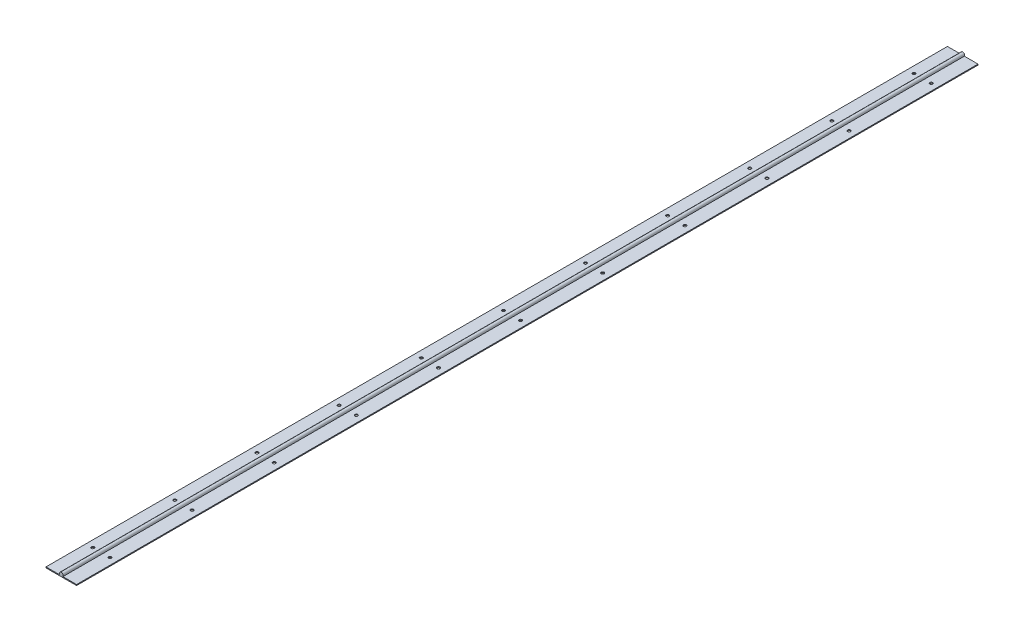
ISO-10303-21;
HEADER;
FILE_DESCRIPTION(('STEP AP214'),'2;1');
FILE_NAME('part.step','',(''),(''),'','','');
FILE_SCHEMA(('AUTOMOTIVE_DESIGN { 1 0 10303 214 1 1 1 1 }'));
ENDSEC;
DATA;
#1=APPLICATION_CONTEXT('core data for automotive mechanical design processes');
#2=APPLICATION_PROTOCOL_DEFINITION('international standard','automotive_design',2000,#1);
#3=PRODUCT_CONTEXT('',#1,'mechanical');
#4=PRODUCT('Part','Part','',(#3));
#5=PRODUCT_RELATED_PRODUCT_CATEGORY('part','',(#4));
#6=PRODUCT_DEFINITION_FORMATION('','',#4);
#7=PRODUCT_DEFINITION_CONTEXT('part definition',#1,'design');
#8=PRODUCT_DEFINITION('design','',#6,#7);
#9=PRODUCT_DEFINITION_SHAPE('','',#8);
#10=(LENGTH_UNIT() NAMED_UNIT(*) SI_UNIT(.MILLI.,.METRE.));
#11=(NAMED_UNIT(*) PLANE_ANGLE_UNIT() SI_UNIT($,.RADIAN.));
#12=(NAMED_UNIT(*) SI_UNIT($,.STERADIAN.) SOLID_ANGLE_UNIT());
#13=UNCERTAINTY_MEASURE_WITH_UNIT(LENGTH_MEASURE(1.E-05),#10,'distance_accuracy_value','');
#14=(GEOMETRIC_REPRESENTATION_CONTEXT(3) GLOBAL_UNCERTAINTY_ASSIGNED_CONTEXT((#13)) GLOBAL_UNIT_ASSIGNED_CONTEXT((#10,
#11,#12)) REPRESENTATION_CONTEXT('',''));
#15=CARTESIAN_POINT('',(0.,0.,0.));
#16=DIRECTION('',(0.,0.,1.));
#17=DIRECTION('',(1.,0.,0.));
#18=AXIS2_PLACEMENT_3D('',#15,#16,#17);
#19=CARTESIAN_POINT('',(-25.4000000000001,0.,-1498.6));
#20=DIRECTION('',(0.,-1.,0.));
#21=DIRECTION('',(0.,0.,-1.));
#22=AXIS2_PLACEMENT_3D('',#19,#20,#21);
#23=PLANE('',#22);
#24=CARTESIAN_POINT('',(-14.3002000000001,0.,-1431.925));
#25=DIRECTION('',(0.,1.,0.));
#26=DIRECTION('',(0.,0.,1.));
#27=AXIS2_PLACEMENT_3D('',#24,#25,#26);
#28=CIRCLE('',#27,2.4257);
#29=CARTESIAN_POINT('',(-14.3002000000001,0.,-1429.4993));
#30=VERTEX_POINT('',#29);
#31=EDGE_CURVE('E196',#30,#30,#28,.T.);
#32=ORIENTED_EDGE('',*,*,#31,.T.);
#33=EDGE_LOOP('',(#32));
#34=FACE_BOUND('',#33,.T.);
#35=CARTESIAN_POINT('',(-14.3002000000002,0.,-1295.4));
#36=DIRECTION('',(0.,1.,0.));
#37=DIRECTION('',(0.,0.,1.));
#38=AXIS2_PLACEMENT_3D('',#35,#36,#37);
#39=CIRCLE('',#38,2.4257);
#40=CARTESIAN_POINT('',(-14.3002000000002,0.,-1292.9743));
#41=VERTEX_POINT('',#40);
#42=EDGE_CURVE('E190',#41,#41,#39,.T.);
#43=ORIENTED_EDGE('',*,*,#42,.T.);
#44=EDGE_LOOP('',(#43));
#45=FACE_BOUND('',#44,.T.);
#46=CARTESIAN_POINT('',(-14.3002000000001,0.,-1158.875));
#47=DIRECTION('',(0.,1.,0.));
#48=DIRECTION('',(0.,0.,1.));
#49=AXIS2_PLACEMENT_3D('',#46,#47,#48);
#50=CIRCLE('',#49,2.4257);
#51=CARTESIAN_POINT('',(-14.3002000000001,0.,-1156.4493));
#52=VERTEX_POINT('',#51);
#53=EDGE_CURVE('E184',#52,#52,#50,.T.);
#54=ORIENTED_EDGE('',*,*,#53,.T.);
#55=EDGE_LOOP('',(#54));
#56=FACE_BOUND('',#55,.T.);
#57=CARTESIAN_POINT('',(-14.3002000000001,0.,-1022.35));
#58=DIRECTION('',(0.,1.,0.));
#59=DIRECTION('',(0.,0.,1.));
#60=AXIS2_PLACEMENT_3D('',#57,#58,#59);
#61=CIRCLE('',#60,2.4257);
#62=CARTESIAN_POINT('',(-14.3002000000001,0.,-1019.9243));
#63=VERTEX_POINT('',#62);
#64=EDGE_CURVE('E178',#63,#63,#61,.T.);
#65=ORIENTED_EDGE('',*,*,#64,.T.);
#66=EDGE_LOOP('',(#65));
#67=FACE_BOUND('',#66,.T.);
#68=CARTESIAN_POINT('',(-14.3002000000001,0.,-885.825));
#69=DIRECTION('',(0.,1.,0.));
#70=DIRECTION('',(0.,0.,1.));
#71=AXIS2_PLACEMENT_3D('',#68,#69,#70);
#72=CIRCLE('',#71,2.4257);
#73=CARTESIAN_POINT('',(-14.3002000000001,0.,-883.3993));
#74=VERTEX_POINT('',#73);
#75=EDGE_CURVE('E172',#74,#74,#72,.T.);
#76=ORIENTED_EDGE('',*,*,#75,.T.);
#77=EDGE_LOOP('',(#76));
#78=FACE_BOUND('',#77,.T.);
#79=CARTESIAN_POINT('',(-14.3002000000001,0.,-749.3));
#80=DIRECTION('',(0.,1.,0.));
#81=DIRECTION('',(0.,0.,1.));
#82=AXIS2_PLACEMENT_3D('',#79,#80,#81);
#83=CIRCLE('',#82,2.4257);
#84=CARTESIAN_POINT('',(-14.3002000000001,0.,-746.8743));
#85=VERTEX_POINT('',#84);
#86=EDGE_CURVE('E166',#85,#85,#83,.T.);
#87=ORIENTED_EDGE('',*,*,#86,.T.);
#88=EDGE_LOOP('',(#87));
#89=FACE_BOUND('',#88,.T.);
#90=CARTESIAN_POINT('',(-14.3002000000001,0.,-612.775));
#91=DIRECTION('',(0.,1.,0.));
#92=DIRECTION('',(0.,0.,1.));
#93=AXIS2_PLACEMENT_3D('',#90,#91,#92);
#94=CIRCLE('',#93,2.4257);
#95=CARTESIAN_POINT('',(-14.3002000000001,0.,-610.3493));
#96=VERTEX_POINT('',#95);
#97=EDGE_CURVE('E160',#96,#96,#94,.T.);
#98=ORIENTED_EDGE('',*,*,#97,.T.);
#99=EDGE_LOOP('',(#98));
#100=FACE_BOUND('',#99,.T.);
#101=CARTESIAN_POINT('',(-14.3002000000001,0.,-476.25));
#102=DIRECTION('',(0.,1.,0.));
#103=DIRECTION('',(0.,0.,1.));
#104=AXIS2_PLACEMENT_3D('',#101,#102,#103);
#105=CIRCLE('',#104,2.4257);
#106=CARTESIAN_POINT('',(-14.3002000000001,0.,-473.8243));
#107=VERTEX_POINT('',#106);
#108=EDGE_CURVE('E154',#107,#107,#105,.T.);
#109=ORIENTED_EDGE('',*,*,#108,.T.);
#110=EDGE_LOOP('',(#109));
#111=FACE_BOUND('',#110,.T.);
#112=CARTESIAN_POINT('',(-14.3002000000001,0.,-339.725));
#113=DIRECTION('',(0.,1.,0.));
#114=DIRECTION('',(0.,0.,1.));
#115=AXIS2_PLACEMENT_3D('',#112,#113,#114);
#116=CIRCLE('',#115,2.4257);
#117=CARTESIAN_POINT('',(-14.3002000000001,0.,-337.2993));
#118=VERTEX_POINT('',#117);
#119=EDGE_CURVE('E148',#118,#118,#116,.T.);
#120=ORIENTED_EDGE('',*,*,#119,.T.);
#121=EDGE_LOOP('',(#120));
#122=FACE_BOUND('',#121,.T.);
#123=CARTESIAN_POINT('',(-14.3002,0.,-203.2));
#124=DIRECTION('',(0.,1.,0.));
#125=DIRECTION('',(0.,0.,1.));
#126=AXIS2_PLACEMENT_3D('',#123,#124,#125);
#127=CIRCLE('',#126,2.4257);
#128=CARTESIAN_POINT('',(-14.3002,0.,-200.7743));
#129=VERTEX_POINT('',#128);
#130=EDGE_CURVE('E602',#129,#129,#127,.T.);
#131=ORIENTED_EDGE('',*,*,#130,.T.);
#132=EDGE_LOOP('',(#131));
#133=FACE_BOUND('',#132,.T.);
#134=CARTESIAN_POINT('',(14.3002,0.,-66.675));
#135=DIRECTION('',(0.,1.,0.));
#136=DIRECTION('',(0.,0.,1.));
#137=AXIS2_PLACEMENT_3D('',#134,#135,#136);
#138=CIRCLE('',#137,2.4257);
#139=CARTESIAN_POINT('',(14.3002,0.,-64.2493));
#140=VERTEX_POINT('',#139);
#141=EDGE_CURVE('E111',#140,#140,#138,.T.);
#142=ORIENTED_EDGE('',*,*,#141,.T.);
#143=EDGE_LOOP('',(#142));
#144=FACE_BOUND('',#143,.T.);
#145=DIRECTION('',(1.,0.,0.));
#146=VECTOR('',#145,1.);
#147=CARTESIAN_POINT('',(-25.4,0.,1.11022302462516E-13));
#148=LINE('',#147,#146);
#149=CARTESIAN_POINT('',(-25.4,0.,1.11022302462516E-13));
#150=VERTEX_POINT('',#149);
#151=CARTESIAN_POINT('',(25.4,0.,0.));
#152=VERTEX_POINT('',#151);
#153=EDGE_CURVE('E98',#150,#152,#148,.T.);
#154=ORIENTED_EDGE('',*,*,#153,.F.);
#155=DIRECTION('',(0.,0.,1.));
#156=VECTOR('',#155,1.);
#157=CARTESIAN_POINT('',(-25.4000000000001,0.,-1498.6));
#158=LINE('',#157,#156);
#159=CARTESIAN_POINT('',(-25.4000000000001,0.,-1498.6));
#160=VERTEX_POINT('',#159);
#161=EDGE_CURVE('E84',#160,#150,#158,.T.);
#162=ORIENTED_EDGE('',*,*,#161,.F.);
#163=DIRECTION('',(1.,0.,0.));
#164=VECTOR('',#163,1.);
#165=CARTESIAN_POINT('',(-25.4000000000001,0.,-1498.6));
#166=LINE('',#165,#164);
#167=CARTESIAN_POINT('',(25.3999999999999,0.,-1498.6));
#168=VERTEX_POINT('',#167);
#169=EDGE_CURVE('E123',#160,#168,#166,.T.);
#170=ORIENTED_EDGE('',*,*,#169,.T.);
#171=DIRECTION('',(0.,0.,1.));
#172=VECTOR('',#171,1.);
#173=CARTESIAN_POINT('',(25.3999999999999,0.,-1498.6));
#174=LINE('',#173,#172);
#175=EDGE_CURVE('E94',#168,#152,#174,.T.);
#176=ORIENTED_EDGE('',*,*,#175,.T.);
#177=EDGE_LOOP('',(#154,#162,#170,#176));
#178=FACE_BOUND('',#177,.T.);
#179=CARTESIAN_POINT('',(-14.3002000000001,0.,-66.675));
#180=DIRECTION('',(0.,1.,0.));
#181=DIRECTION('',(0.,0.,1.));
#182=AXIS2_PLACEMENT_3D('',#179,#180,#181);
#183=CIRCLE('',#182,2.4257);
#184=CARTESIAN_POINT('',(-14.3002000000001,0.,-64.2493));
#185=VERTEX_POINT('',#184);
#186=EDGE_CURVE('E145',#185,#185,#183,.T.);
#187=ORIENTED_EDGE('',*,*,#186,.T.);
#188=EDGE_LOOP('',(#187));
#189=FACE_BOUND('',#188,.T.);
#190=CARTESIAN_POINT('',(14.3002,0.,-203.2));
#191=DIRECTION('',(0.,1.,0.));
#192=DIRECTION('',(0.,0.,1.));
#193=AXIS2_PLACEMENT_3D('',#190,#191,#192);
#194=CIRCLE('',#193,2.4257);
#195=CARTESIAN_POINT('',(14.3002,0.,-200.7743));
#196=VERTEX_POINT('',#195);
#197=EDGE_CURVE('E611',#196,#196,#194,.T.);
#198=ORIENTED_EDGE('',*,*,#197,.T.);
#199=EDGE_LOOP('',(#198));
#200=FACE_BOUND('',#199,.T.);
#201=CARTESIAN_POINT('',(14.3001999999999,0.,-339.725));
#202=DIRECTION('',(0.,1.,0.));
#203=DIRECTION('',(0.,0.,1.));
#204=AXIS2_PLACEMENT_3D('',#201,#202,#203);
#205=CIRCLE('',#204,2.4257);
#206=CARTESIAN_POINT('',(14.3001999999999,0.,-337.2993));
#207=VERTEX_POINT('',#206);
#208=EDGE_CURVE('E202',#207,#207,#205,.T.);
#209=ORIENTED_EDGE('',*,*,#208,.T.);
#210=EDGE_LOOP('',(#209));
#211=FACE_BOUND('',#210,.T.);
#212=CARTESIAN_POINT('',(14.3002,0.,-476.25));
#213=DIRECTION('',(0.,1.,0.));
#214=DIRECTION('',(0.,0.,1.));
#215=AXIS2_PLACEMENT_3D('',#212,#213,#214);
#216=CIRCLE('',#215,2.4257);
#217=CARTESIAN_POINT('',(14.3002,0.,-473.8243));
#218=VERTEX_POINT('',#217);
#219=EDGE_CURVE('E208',#218,#218,#216,.T.);
#220=ORIENTED_EDGE('',*,*,#219,.T.);
#221=EDGE_LOOP('',(#220));
#222=FACE_BOUND('',#221,.T.);
#223=CARTESIAN_POINT('',(14.3001999999999,0.,-612.775));
#224=DIRECTION('',(0.,1.,0.));
#225=DIRECTION('',(0.,0.,1.));
#226=AXIS2_PLACEMENT_3D('',#223,#224,#225);
#227=CIRCLE('',#226,2.4257);
#228=CARTESIAN_POINT('',(14.3001999999999,0.,-610.3493));
#229=VERTEX_POINT('',#228);
#230=EDGE_CURVE('E214',#229,#229,#227,.T.);
#231=ORIENTED_EDGE('',*,*,#230,.T.);
#232=EDGE_LOOP('',(#231));
#233=FACE_BOUND('',#232,.T.);
#234=CARTESIAN_POINT('',(14.3001999999999,0.,-749.3));
#235=DIRECTION('',(0.,1.,0.));
#236=DIRECTION('',(0.,0.,1.));
#237=AXIS2_PLACEMENT_3D('',#234,#235,#236);
#238=CIRCLE('',#237,2.4257);
#239=CARTESIAN_POINT('',(14.3001999999999,0.,-746.8743));
#240=VERTEX_POINT('',#239);
#241=EDGE_CURVE('E220',#240,#240,#238,.T.);
#242=ORIENTED_EDGE('',*,*,#241,.T.);
#243=EDGE_LOOP('',(#242));
#244=FACE_BOUND('',#243,.T.);
#245=CARTESIAN_POINT('',(14.3001999999999,0.,-885.825));
#246=DIRECTION('',(0.,1.,0.));
#247=DIRECTION('',(0.,0.,1.));
#248=AXIS2_PLACEMENT_3D('',#245,#246,#247);
#249=CIRCLE('',#248,2.4257);
#250=CARTESIAN_POINT('',(14.3001999999999,0.,-883.3993));
#251=VERTEX_POINT('',#250);
#252=EDGE_CURVE('E226',#251,#251,#249,.T.);
#253=ORIENTED_EDGE('',*,*,#252,.T.);
#254=EDGE_LOOP('',(#253));
#255=FACE_BOUND('',#254,.T.);
#256=CARTESIAN_POINT('',(14.3001999999999,0.,-1022.35));
#257=DIRECTION('',(0.,1.,0.));
#258=DIRECTION('',(0.,0.,1.));
#259=AXIS2_PLACEMENT_3D('',#256,#257,#258);
#260=CIRCLE('',#259,2.4257);
#261=CARTESIAN_POINT('',(14.3001999999999,0.,-1019.9243));
#262=VERTEX_POINT('',#261);
#263=EDGE_CURVE('E232',#262,#262,#260,.T.);
#264=ORIENTED_EDGE('',*,*,#263,.T.);
#265=EDGE_LOOP('',(#264));
#266=FACE_BOUND('',#265,.T.);
#267=CARTESIAN_POINT('',(14.3001999999999,0.,-1158.875));
#268=DIRECTION('',(0.,1.,0.));
#269=DIRECTION('',(0.,0.,1.));
#270=AXIS2_PLACEMENT_3D('',#267,#268,#269);
#271=CIRCLE('',#270,2.4257);
#272=CARTESIAN_POINT('',(14.3001999999999,0.,-1156.4493));
#273=VERTEX_POINT('',#272);
#274=EDGE_CURVE('E238',#273,#273,#271,.T.);
#275=ORIENTED_EDGE('',*,*,#274,.T.);
#276=EDGE_LOOP('',(#275));
#277=FACE_BOUND('',#276,.T.);
#278=CARTESIAN_POINT('',(14.3001999999999,0.,-1295.4));
#279=DIRECTION('',(0.,1.,0.));
#280=DIRECTION('',(0.,0.,1.));
#281=AXIS2_PLACEMENT_3D('',#278,#279,#280);
#282=CIRCLE('',#281,2.4257);
#283=CARTESIAN_POINT('',(14.3001999999999,0.,-1292.9743));
#284=VERTEX_POINT('',#283);
#285=EDGE_CURVE('E244',#284,#284,#282,.T.);
#286=ORIENTED_EDGE('',*,*,#285,.T.);
#287=EDGE_LOOP('',(#286));
#288=FACE_BOUND('',#287,.T.);
#289=CARTESIAN_POINT('',(14.3001999999999,0.,-1431.925));
#290=DIRECTION('',(0.,1.,0.));
#291=DIRECTION('',(0.,0.,1.));
#292=AXIS2_PLACEMENT_3D('',#289,#290,#291);
#293=CIRCLE('',#292,2.4257);
#294=CARTESIAN_POINT('',(14.3001999999999,0.,-1429.4993));
#295=VERTEX_POINT('',#294);
#296=EDGE_CURVE('E11',#295,#295,#293,.T.);
#297=ORIENTED_EDGE('',*,*,#296,.T.);
#298=EDGE_LOOP('',(#297));
#299=FACE_BOUND('',#298,.T.);
#300=ADVANCED_FACE('F32',(#34,#45,#56,#67,#78,#89,#100,#111,#122,#133,#144,#178,#189,#200,#211,
#222,#233,#244,#255,#266,#277,#288,#299),#23,.T.);
#301=CARTESIAN_POINT('',(25.3999999999999,1.52399999999996,-1498.6));
#302=DIRECTION('',(0.,1.,0.));
#303=DIRECTION('',(-1.,0.,0.));
#304=AXIS2_PLACEMENT_3D('',#301,#302,#303);
#305=PLANE('',#304);
#306=CARTESIAN_POINT('',(14.3002,1.52400000000001,-66.675));
#307=DIRECTION('',(0.,1.,0.));
#308=DIRECTION('',(-1.,0.,0.));
#309=AXIS2_PLACEMENT_3D('',#306,#307,#308);
#310=CIRCLE('',#309,2.4257);
#311=CARTESIAN_POINT('',(11.8745,1.52400000000001,-66.675));
#312=VERTEX_POINT('',#311);
#313=EDGE_CURVE('E108',#312,#312,#310,.F.);
#314=ORIENTED_EDGE('',*,*,#313,.T.);
#315=EDGE_LOOP('',(#314));
#316=FACE_BOUND('',#315,.T.);
#317=DIRECTION('',(-1.,0.,0.));
#318=VECTOR('',#317,1.);
#319=CARTESIAN_POINT('',(25.4,1.52400000000003,0.));
#320=LINE('',#319,#318);
#321=CARTESIAN_POINT('',(25.4,1.52400000000003,0.));
#322=VERTEX_POINT('',#321);
#323=CARTESIAN_POINT('',(2.71197787601593,1.52399999999998,-1.11022302462516E-13));
#324=VERTEX_POINT('',#323);
#325=EDGE_CURVE('E116',#322,#324,#320,.T.);
#326=ORIENTED_EDGE('',*,*,#325,.F.);
#327=DIRECTION('',(0.,0.,1.));
#328=VECTOR('',#327,1.);
#329=CARTESIAN_POINT('',(25.3999999999999,1.52399999999996,-1498.6));
#330=LINE('',#329,#328);
#331=CARTESIAN_POINT('',(25.3999999999999,1.52399999999996,-1498.6));
#332=VERTEX_POINT('',#331);
#333=EDGE_CURVE('E139',#332,#322,#330,.T.);
#334=ORIENTED_EDGE('',*,*,#333,.F.);
#335=DIRECTION('',(-1.,0.,0.));
#336=VECTOR('',#335,1.);
#337=CARTESIAN_POINT('',(25.3999999999999,1.52399999999996,-1498.6));
#338=LINE('',#337,#336);
#339=CARTESIAN_POINT('',(2.71197787601588,1.52399999999996,-1498.6));
#340=VERTEX_POINT('',#339);
#341=EDGE_CURVE('E128',#332,#340,#338,.T.);
#342=ORIENTED_EDGE('',*,*,#341,.T.);
#343=DIRECTION('',(0.,0.,1.));
#344=VECTOR('',#343,1.);
#345=CARTESIAN_POINT('',(2.71197787601588,1.52399999999996,-1498.6));
#346=LINE('',#345,#344);
#347=EDGE_CURVE('E137',#340,#324,#346,.T.);
#348=ORIENTED_EDGE('',*,*,#347,.T.);
#349=EDGE_LOOP('',(#326,#334,#342,#348));
#350=FACE_BOUND('',#349,.T.);
#351=CARTESIAN_POINT('',(14.3001999999999,1.524,-203.2));
#352=DIRECTION('',(0.,1.,0.));
#353=DIRECTION('',(-1.,0.,0.));
#354=AXIS2_PLACEMENT_3D('',#351,#352,#353);
#355=CIRCLE('',#354,2.4257);
#356=CARTESIAN_POINT('',(11.8744999999999,1.524,-203.2));
#357=VERTEX_POINT('',#356);
#358=EDGE_CURVE('E614',#357,#357,#355,.F.);
#359=ORIENTED_EDGE('',*,*,#358,.T.);
#360=EDGE_LOOP('',(#359));
#361=FACE_BOUND('',#360,.T.);
#362=CARTESIAN_POINT('',(14.3001999999999,1.524,-339.725));
#363=DIRECTION('',(0.,1.,0.));
#364=DIRECTION('',(-1.,0.,0.));
#365=AXIS2_PLACEMENT_3D('',#362,#363,#364);
#366=CIRCLE('',#365,2.4257);
#367=CARTESIAN_POINT('',(11.8744999999999,1.524,-339.725));
#368=VERTEX_POINT('',#367);
#369=EDGE_CURVE('E199',#368,#368,#366,.F.);
#370=ORIENTED_EDGE('',*,*,#369,.T.);
#371=EDGE_LOOP('',(#370));
#372=FACE_BOUND('',#371,.T.);
#373=CARTESIAN_POINT('',(14.3001999999999,1.52399999999998,-476.25));
#374=DIRECTION('',(0.,1.,0.));
#375=DIRECTION('',(-1.,0.,0.));
#376=AXIS2_PLACEMENT_3D('',#373,#374,#375);
#377=CIRCLE('',#376,2.4257);
#378=CARTESIAN_POINT('',(11.8744999999999,1.52399999999998,-476.25));
#379=VERTEX_POINT('',#378);
#380=EDGE_CURVE('E205',#379,#379,#377,.F.);
#381=ORIENTED_EDGE('',*,*,#380,.T.);
#382=EDGE_LOOP('',(#381));
#383=FACE_BOUND('',#382,.T.);
#384=CARTESIAN_POINT('',(14.3001999999999,1.524,-612.775));
#385=DIRECTION('',(0.,1.,0.));
#386=DIRECTION('',(-1.,0.,0.));
#387=AXIS2_PLACEMENT_3D('',#384,#385,#386);
#388=CIRCLE('',#387,2.4257);
#389=CARTESIAN_POINT('',(11.8744999999999,1.524,-612.775));
#390=VERTEX_POINT('',#389);
#391=EDGE_CURVE('E211',#390,#390,#388,.F.);
#392=ORIENTED_EDGE('',*,*,#391,.T.);
#393=EDGE_LOOP('',(#392));
#394=FACE_BOUND('',#393,.T.);
#395=CARTESIAN_POINT('',(14.3001999999999,1.52399999999998,-749.3));
#396=DIRECTION('',(0.,1.,0.));
#397=DIRECTION('',(-1.,0.,0.));
#398=AXIS2_PLACEMENT_3D('',#395,#396,#397);
#399=CIRCLE('',#398,2.4257);
#400=CARTESIAN_POINT('',(11.8744999999999,1.52399999999998,-749.3));
#401=VERTEX_POINT('',#400);
#402=EDGE_CURVE('E217',#401,#401,#399,.F.);
#403=ORIENTED_EDGE('',*,*,#402,.T.);
#404=EDGE_LOOP('',(#403));
#405=FACE_BOUND('',#404,.T.);
#406=CARTESIAN_POINT('',(14.3001999999999,1.52399999999996,-885.825));
#407=DIRECTION('',(0.,1.,0.));
#408=DIRECTION('',(-1.,0.,0.));
#409=AXIS2_PLACEMENT_3D('',#406,#407,#408);
#410=CIRCLE('',#409,2.4257);
#411=CARTESIAN_POINT('',(11.8744999999999,1.52399999999996,-885.825));
#412=VERTEX_POINT('',#411);
#413=EDGE_CURVE('E223',#412,#412,#410,.F.);
#414=ORIENTED_EDGE('',*,*,#413,.T.);
#415=EDGE_LOOP('',(#414));
#416=FACE_BOUND('',#415,.T.);
#417=CARTESIAN_POINT('',(14.3001999999999,1.52399999999994,-1022.35));
#418=DIRECTION('',(0.,1.,0.));
#419=DIRECTION('',(-1.,0.,0.));
#420=AXIS2_PLACEMENT_3D('',#417,#418,#419);
#421=CIRCLE('',#420,2.4257);
#422=CARTESIAN_POINT('',(11.8744999999999,1.52399999999994,-1022.35));
#423=VERTEX_POINT('',#422);
#424=EDGE_CURVE('E229',#423,#423,#421,.F.);
#425=ORIENTED_EDGE('',*,*,#424,.T.);
#426=EDGE_LOOP('',(#425));
#427=FACE_BOUND('',#426,.T.);
#428=CARTESIAN_POINT('',(14.3001999999999,1.52399999999991,-1158.875));
#429=DIRECTION('',(0.,1.,0.));
#430=DIRECTION('',(-1.,0.,0.));
#431=AXIS2_PLACEMENT_3D('',#428,#429,#430);
#432=CIRCLE('',#431,2.4257);
#433=CARTESIAN_POINT('',(11.8744999999999,1.52399999999991,-1158.875));
#434=VERTEX_POINT('',#433);
#435=EDGE_CURVE('E235',#434,#434,#432,.F.);
#436=ORIENTED_EDGE('',*,*,#435,.T.);
#437=EDGE_LOOP('',(#436));
#438=FACE_BOUND('',#437,.T.);
#439=CARTESIAN_POINT('',(14.3001999999999,1.52399999999993,-1295.4));
#440=DIRECTION('',(0.,1.,0.));
#441=DIRECTION('',(-1.,0.,0.));
#442=AXIS2_PLACEMENT_3D('',#439,#440,#441);
#443=CIRCLE('',#442,2.4257);
#444=CARTESIAN_POINT('',(11.8744999999999,1.52399999999993,-1295.4));
#445=VERTEX_POINT('',#444);
#446=EDGE_CURVE('E241',#445,#445,#443,.F.);
#447=ORIENTED_EDGE('',*,*,#446,.T.);
#448=EDGE_LOOP('',(#447));
#449=FACE_BOUND('',#448,.T.);
#450=CARTESIAN_POINT('',(14.3001999999999,1.52399999999993,-1431.925));
#451=DIRECTION('',(0.,1.,0.));
#452=DIRECTION('',(-1.,0.,0.));
#453=AXIS2_PLACEMENT_3D('',#450,#451,#452);
#454=CIRCLE('',#453,2.4257);
#455=CARTESIAN_POINT('',(11.8744999999999,1.52399999999993,-1431.925));
#456=VERTEX_POINT('',#455);
#457=EDGE_CURVE('E40',#456,#456,#454,.F.);
#458=ORIENTED_EDGE('',*,*,#457,.T.);
#459=EDGE_LOOP('',(#458));
#460=FACE_BOUND('',#459,.T.);
#461=ADVANCED_FACE('F249',(#316,#350,#361,#372,#383,#394,#405,#416,#427,#438,#449,#460),#305,.T.);
#462=CARTESIAN_POINT('',(-2.71197787601601,1.52399999999987,-1498.6));
#463=DIRECTION('',(0.,1.,0.));
#464=DIRECTION('',(-1.,0.,0.));
#465=AXIS2_PLACEMENT_3D('',#462,#463,#464);
#466=PLANE('',#465);
#467=CARTESIAN_POINT('',(-14.3002000000001,1.52400000000001,-66.675));
#468=DIRECTION('',(0.,1.,0.));
#469=DIRECTION('',(-1.,0.,0.));
#470=AXIS2_PLACEMENT_3D('',#467,#468,#469);
#471=CIRCLE('',#470,2.4257);
#472=CARTESIAN_POINT('',(-16.7259000000001,1.52400000000001,-66.675));
#473=VERTEX_POINT('',#472);
#474=EDGE_CURVE('E142',#473,#473,#471,.F.);
#475=ORIENTED_EDGE('',*,*,#474,.T.);
#476=EDGE_LOOP('',(#475));
#477=FACE_BOUND('',#476,.T.);
#478=DIRECTION('',(-1.,0.,0.));
#479=VECTOR('',#478,1.);
#480=CARTESIAN_POINT('',(-2.71197787601599,1.52400000000003,0.));
#481=LINE('',#480,#479);
#482=CARTESIAN_POINT('',(-2.71197787601599,1.52400000000003,0.));
#483=VERTEX_POINT('',#482);
#484=CARTESIAN_POINT('',(-25.4,1.524,1.11022302462516E-13));
#485=VERTEX_POINT('',#484);
#486=EDGE_CURVE('E107',#483,#485,#481,.T.);
#487=ORIENTED_EDGE('',*,*,#486,.F.);
#488=DIRECTION('',(0.,0.,1.));
#489=VECTOR('',#488,1.);
#490=CARTESIAN_POINT('',(-2.71197787601601,1.52399999999987,-1498.6));
#491=LINE('',#490,#489);
#492=CARTESIAN_POINT('',(-2.71197787601601,1.52399999999987,-1498.6));
#493=VERTEX_POINT('',#492);
#494=EDGE_CURVE('E55',#493,#483,#491,.T.);
#495=ORIENTED_EDGE('',*,*,#494,.F.);
#496=DIRECTION('',(-1.,0.,0.));
#497=VECTOR('',#496,1.);
#498=CARTESIAN_POINT('',(-2.71197787601601,1.52399999999987,-1498.6));
#499=LINE('',#498,#497);
#500=CARTESIAN_POINT('',(-25.4000000000001,1.52399999999993,-1498.6));
#501=VERTEX_POINT('',#500);
#502=EDGE_CURVE('E95',#493,#501,#499,.T.);
#503=ORIENTED_EDGE('',*,*,#502,.T.);
#504=DIRECTION('',(0.,0.,1.));
#505=VECTOR('',#504,1.);
#506=CARTESIAN_POINT('',(-25.4000000000001,1.52399999999993,-1498.6));
#507=LINE('',#506,#505);
#508=EDGE_CURVE('E47',#501,#485,#507,.T.);
#509=ORIENTED_EDGE('',*,*,#508,.T.);
#510=EDGE_LOOP('',(#487,#495,#503,#509));
#511=FACE_BOUND('',#510,.T.);
#512=CARTESIAN_POINT('',(-14.3002,1.524,-203.2));
#513=DIRECTION('',(0.,1.,0.));
#514=DIRECTION('',(-1.,0.,0.));
#515=AXIS2_PLACEMENT_3D('',#512,#513,#514);
#516=CIRCLE('',#515,2.4257);
#517=CARTESIAN_POINT('',(-16.7259,1.524,-203.2));
#518=VERTEX_POINT('',#517);
#519=EDGE_CURVE('E562',#518,#518,#516,.F.);
#520=ORIENTED_EDGE('',*,*,#519,.T.);
#521=EDGE_LOOP('',(#520));
#522=FACE_BOUND('',#521,.T.);
#523=CARTESIAN_POINT('',(-14.3002000000001,1.52399999999998,-339.725));
#524=DIRECTION('',(0.,1.,0.));
#525=DIRECTION('',(-1.,0.,0.));
#526=AXIS2_PLACEMENT_3D('',#523,#524,#525);
#527=CIRCLE('',#526,2.4257);
#528=CARTESIAN_POINT('',(-16.7259000000001,1.52399999999998,-339.725));
#529=VERTEX_POINT('',#528);
#530=EDGE_CURVE('E135',#529,#529,#527,.F.);
#531=ORIENTED_EDGE('',*,*,#530,.T.);
#532=EDGE_LOOP('',(#531));
#533=FACE_BOUND('',#532,.T.);
#534=CARTESIAN_POINT('',(-14.3002000000001,1.524,-476.25));
#535=DIRECTION('',(0.,1.,0.));
#536=DIRECTION('',(-1.,0.,0.));
#537=AXIS2_PLACEMENT_3D('',#534,#535,#536);
#538=CIRCLE('',#537,2.4257);
#539=CARTESIAN_POINT('',(-16.7259000000001,1.524,-476.25));
#540=VERTEX_POINT('',#539);
#541=EDGE_CURVE('E151',#540,#540,#538,.F.);
#542=ORIENTED_EDGE('',*,*,#541,.T.);
#543=EDGE_LOOP('',(#542));
#544=FACE_BOUND('',#543,.T.);
#545=CARTESIAN_POINT('',(-14.3002000000001,1.52399999999998,-612.775));
#546=DIRECTION('',(0.,1.,0.));
#547=DIRECTION('',(-1.,0.,0.));
#548=AXIS2_PLACEMENT_3D('',#545,#546,#547);
#549=CIRCLE('',#548,2.4257);
#550=CARTESIAN_POINT('',(-16.7259000000001,1.52399999999998,-612.775));
#551=VERTEX_POINT('',#550);
#552=EDGE_CURVE('E157',#551,#551,#549,.F.);
#553=ORIENTED_EDGE('',*,*,#552,.T.);
#554=EDGE_LOOP('',(#553));
#555=FACE_BOUND('',#554,.T.);
#556=CARTESIAN_POINT('',(-14.3002000000001,1.52399999999997,-749.3));
#557=DIRECTION('',(0.,1.,0.));
#558=DIRECTION('',(-1.,0.,0.));
#559=AXIS2_PLACEMENT_3D('',#556,#557,#558);
#560=CIRCLE('',#559,2.4257);
#561=CARTESIAN_POINT('',(-16.7259000000001,1.52399999999997,-749.3));
#562=VERTEX_POINT('',#561);
#563=EDGE_CURVE('E163',#562,#562,#560,.F.);
#564=ORIENTED_EDGE('',*,*,#563,.T.);
#565=EDGE_LOOP('',(#564));
#566=FACE_BOUND('',#565,.T.);
#567=CARTESIAN_POINT('',(-14.3002000000001,1.52399999999997,-885.825000000001));
#568=DIRECTION('',(0.,1.,0.));
#569=DIRECTION('',(-1.,0.,0.));
#570=AXIS2_PLACEMENT_3D('',#567,#568,#569);
#571=CIRCLE('',#570,2.4257);
#572=CARTESIAN_POINT('',(-16.7259000000001,1.52399999999997,-885.825000000001));
#573=VERTEX_POINT('',#572);
#574=EDGE_CURVE('E169',#573,#573,#571,.F.);
#575=ORIENTED_EDGE('',*,*,#574,.T.);
#576=EDGE_LOOP('',(#575));
#577=FACE_BOUND('',#576,.T.);
#578=CARTESIAN_POINT('',(-14.3002000000001,1.52399999999996,-1022.35));
#579=DIRECTION('',(0.,1.,0.));
#580=DIRECTION('',(-1.,0.,0.));
#581=AXIS2_PLACEMENT_3D('',#578,#579,#580);
#582=CIRCLE('',#581,2.4257);
#583=CARTESIAN_POINT('',(-16.7259000000001,1.52399999999996,-1022.35));
#584=VERTEX_POINT('',#583);
#585=EDGE_CURVE('E175',#584,#584,#582,.F.);
#586=ORIENTED_EDGE('',*,*,#585,.T.);
#587=EDGE_LOOP('',(#586));
#588=FACE_BOUND('',#587,.T.);
#589=CARTESIAN_POINT('',(-14.3002000000001,1.52399999999994,-1158.875));
#590=DIRECTION('',(0.,1.,0.));
#591=DIRECTION('',(-1.,0.,0.));
#592=AXIS2_PLACEMENT_3D('',#589,#590,#591);
#593=CIRCLE('',#592,2.4257);
#594=CARTESIAN_POINT('',(-16.7259000000001,1.52399999999994,-1158.875));
#595=VERTEX_POINT('',#594);
#596=EDGE_CURVE('E181',#595,#595,#593,.F.);
#597=ORIENTED_EDGE('',*,*,#596,.T.);
#598=EDGE_LOOP('',(#597));
#599=FACE_BOUND('',#598,.T.);
#600=CARTESIAN_POINT('',(-14.3002000000002,1.52399999999993,-1295.4));
#601=DIRECTION('',(0.,1.,0.));
#602=DIRECTION('',(-1.,0.,0.));
#603=AXIS2_PLACEMENT_3D('',#600,#601,#602);
#604=CIRCLE('',#603,2.4257);
#605=CARTESIAN_POINT('',(-16.7259000000002,1.52399999999993,-1295.4));
#606=VERTEX_POINT('',#605);
#607=EDGE_CURVE('E187',#606,#606,#604,.F.);
#608=ORIENTED_EDGE('',*,*,#607,.T.);
#609=EDGE_LOOP('',(#608));
#610=FACE_BOUND('',#609,.T.);
#611=CARTESIAN_POINT('',(-14.3002000000001,1.52399999999998,-1431.925));
#612=DIRECTION('',(0.,1.,0.));
#613=DIRECTION('',(-1.,0.,0.));
#614=AXIS2_PLACEMENT_3D('',#611,#612,#613);
#615=CIRCLE('',#614,2.4257);
#616=CARTESIAN_POINT('',(-16.7259000000001,1.52399999999998,-1431.925));
#617=VERTEX_POINT('',#616);
#618=EDGE_CURVE('E193',#617,#617,#615,.F.);
#619=ORIENTED_EDGE('',*,*,#618,.T.);
#620=EDGE_LOOP('',(#619));
#621=FACE_BOUND('',#620,.T.);
#622=ADVANCED_FACE('F262',(#477,#511,#522,#533,#544,#555,#566,#577,#588,#599,#610,#621),#466,.T.);
#623=CARTESIAN_POINT('',(-25.4000000000001,1.52399999999993,-1498.6));
#624=DIRECTION('',(-1.,0.,0.));
#625=DIRECTION('',(0.,0.,1.));
#626=AXIS2_PLACEMENT_3D('',#623,#624,#625);
#627=PLANE('',#626);
#628=DIRECTION('',(0.,-1.,0.));
#629=VECTOR('',#628,1.);
#630=CARTESIAN_POINT('',(-25.4,1.524,1.11022302462516E-13));
#631=LINE('',#630,#629);
#632=EDGE_CURVE('E88',#485,#150,#631,.T.);
#633=ORIENTED_EDGE('',*,*,#632,.F.);
#634=ORIENTED_EDGE('',*,*,#508,.F.);
#635=DIRECTION('',(0.,-1.,0.));
#636=VECTOR('',#635,1.);
#637=CARTESIAN_POINT('',(-25.4000000000001,1.52399999999993,-1498.6));
#638=LINE('',#637,#636);
#639=EDGE_CURVE('E90',#501,#160,#638,.T.);
#640=ORIENTED_EDGE('',*,*,#639,.T.);
#641=ORIENTED_EDGE('',*,*,#161,.T.);
#642=EDGE_LOOP('',(#633,#634,#640,#641));
#643=FACE_BOUND('',#642,.T.);
#644=ADVANCED_FACE('F86',(#643),#627,.T.);
#645=CARTESIAN_POINT('',(0.,3.17499999999997,-1498.6));
#646=DIRECTION('',(0.,0.,1.));
#647=DIRECTION('',(1.,0.,0.));
#648=AXIS2_PLACEMENT_3D('',#645,#646,#647);
#649=CYLINDRICAL_SURFACE('',#648,3.175);
#650=CARTESIAN_POINT('',(0.,3.17500000000004,0.));
#651=DIRECTION('',(0.,0.,1.));
#652=DIRECTION('',(1.,0.,0.));
#653=AXIS2_PLACEMENT_3D('',#650,#651,#652);
#654=CIRCLE('',#653,3.175);
#655=EDGE_CURVE('E119',#324,#483,#654,.T.);
#656=ORIENTED_EDGE('',*,*,#655,.F.);
#657=ORIENTED_EDGE('',*,*,#347,.F.);
#658=CARTESIAN_POINT('',(0.,3.17499999999997,-1498.6));
#659=DIRECTION('',(0.,0.,1.));
#660=DIRECTION('',(1.,0.,0.));
#661=AXIS2_PLACEMENT_3D('',#658,#659,#660);
#662=CIRCLE('',#661,3.175);
#663=EDGE_CURVE('E131',#340,#493,#662,.T.);
#664=ORIENTED_EDGE('',*,*,#663,.T.);
#665=ORIENTED_EDGE('',*,*,#494,.T.);
#666=EDGE_LOOP('',(#656,#657,#664,#665));
#667=FACE_BOUND('',#666,.T.);
#668=ADVANCED_FACE('F271',(#667),#649,.T.);
#669=CARTESIAN_POINT('',(25.3999999999999,0.,-1498.6));
#670=DIRECTION('',(1.,0.,0.));
#671=DIRECTION('',(0.,0.,-1.));
#672=AXIS2_PLACEMENT_3D('',#669,#670,#671);
#673=PLANE('',#672);
#674=DIRECTION('',(0.,1.,0.));
#675=VECTOR('',#674,1.);
#676=CARTESIAN_POINT('',(25.4,0.,0.));
#677=LINE('',#676,#675);
#678=EDGE_CURVE('E103',#152,#322,#677,.T.);
#679=ORIENTED_EDGE('',*,*,#678,.F.);
#680=ORIENTED_EDGE('',*,*,#175,.F.);
#681=DIRECTION('',(0.,1.,0.));
#682=VECTOR('',#681,1.);
#683=CARTESIAN_POINT('',(25.3999999999999,0.,-1498.6));
#684=LINE('',#683,#682);
#685=EDGE_CURVE('E125',#168,#332,#684,.T.);
#686=ORIENTED_EDGE('',*,*,#685,.T.);
#687=ORIENTED_EDGE('',*,*,#333,.T.);
#688=EDGE_LOOP('',(#679,#680,#686,#687));
#689=FACE_BOUND('',#688,.T.);
#690=ADVANCED_FACE('F268',(#689),#673,.T.);
#691=CARTESIAN_POINT('',(0.,3.17499999999997,-1498.6));
#692=DIRECTION('',(0.,0.,1.));
#693=DIRECTION('',(1.,0.,0.));
#694=AXIS2_PLACEMENT_3D('',#691,#692,#693);
#695=PLANE('',#694);
#696=ORIENTED_EDGE('',*,*,#639,.F.);
#697=ORIENTED_EDGE('',*,*,#502,.F.);
#698=ORIENTED_EDGE('',*,*,#663,.F.);
#699=ORIENTED_EDGE('',*,*,#341,.F.);
#700=ORIENTED_EDGE('',*,*,#685,.F.);
#701=ORIENTED_EDGE('',*,*,#169,.F.);
#702=EDGE_LOOP('',(#696,#697,#698,#699,#700,#701));
#703=FACE_BOUND('',#702,.T.);
#704=ADVANCED_FACE('F495',(#703),#695,.F.);
#705=CARTESIAN_POINT('',(0.,3.17500000000004,0.));
#706=DIRECTION('',(0.,0.,1.));
#707=DIRECTION('',(1.,0.,0.));
#708=AXIS2_PLACEMENT_3D('',#705,#706,#707);
#709=PLANE('',#708);
#710=ORIENTED_EDGE('',*,*,#632,.T.);
#711=ORIENTED_EDGE('',*,*,#153,.T.);
#712=ORIENTED_EDGE('',*,*,#678,.T.);
#713=ORIENTED_EDGE('',*,*,#325,.T.);
#714=ORIENTED_EDGE('',*,*,#655,.T.);
#715=ORIENTED_EDGE('',*,*,#486,.T.);
#716=EDGE_LOOP('',(#710,#711,#712,#713,#714,#715));
#717=FACE_BOUND('',#716,.T.);
#718=ADVANCED_FACE('F105',(#717),#709,.T.);
#719=CARTESIAN_POINT('',(14.3002,6.35000000000001,-66.675));
#720=DIRECTION('',(0.,-1.,0.));
#721=DIRECTION('',(0.,0.,-1.));
#722=AXIS2_PLACEMENT_3D('',#719,#720,#721);
#723=CYLINDRICAL_SURFACE('',#722,2.4257);
#724=ORIENTED_EDGE('',*,*,#313,.F.);
#725=EDGE_LOOP('',(#724));
#726=FACE_BOUND('',#725,.T.);
#727=ORIENTED_EDGE('',*,*,#141,.F.);
#728=EDGE_LOOP('',(#727));
#729=FACE_BOUND('',#728,.T.);
#730=ADVANCED_FACE('F478',(#726,#729),#723,.F.);
#731=CARTESIAN_POINT('',(-14.3002,6.35000000000005,-66.6749999999999));
#732=DIRECTION('',(0.,-1.,0.));
#733=DIRECTION('',(0.,0.,-1.));
#734=AXIS2_PLACEMENT_3D('',#731,#732,#733);
#735=CYLINDRICAL_SURFACE('',#734,2.4257);
#736=ORIENTED_EDGE('',*,*,#474,.F.);
#737=EDGE_LOOP('',(#736));
#738=FACE_BOUND('',#737,.T.);
#739=ORIENTED_EDGE('',*,*,#186,.F.);
#740=EDGE_LOOP('',(#739));
#741=FACE_BOUND('',#740,.T.);
#742=ADVANCED_FACE('F451',(#738,#741),#735,.F.);
#743=CARTESIAN_POINT('',(-14.3002,6.35000000000004,-203.2));
#744=DIRECTION('',(0.,-1.,0.));
#745=DIRECTION('',(0.,0.,-1.));
#746=AXIS2_PLACEMENT_3D('',#743,#744,#745);
#747=CYLINDRICAL_SURFACE('',#746,2.4257);
#748=ORIENTED_EDGE('',*,*,#519,.F.);
#749=EDGE_LOOP('',(#748));
#750=FACE_BOUND('',#749,.T.);
#751=ORIENTED_EDGE('',*,*,#130,.F.);
#752=EDGE_LOOP('',(#751));
#753=FACE_BOUND('',#752,.T.);
#754=ADVANCED_FACE('F276',(#750,#753),#747,.F.);
#755=CARTESIAN_POINT('',(-14.3002000000001,6.34999999999999,-339.725));
#756=DIRECTION('',(0.,-1.,0.));
#757=DIRECTION('',(0.,0.,-1.));
#758=AXIS2_PLACEMENT_3D('',#755,#756,#757);
#759=CYLINDRICAL_SURFACE('',#758,2.4257);
#760=ORIENTED_EDGE('',*,*,#530,.F.);
#761=EDGE_LOOP('',(#760));
#762=FACE_BOUND('',#761,.T.);
#763=ORIENTED_EDGE('',*,*,#119,.F.);
#764=EDGE_LOOP('',(#763));
#765=FACE_BOUND('',#764,.T.);
#766=ADVANCED_FACE('F272',(#762,#765),#759,.F.);
#767=CARTESIAN_POINT('',(-14.3002000000001,6.34999999999999,-476.25));
#768=DIRECTION('',(0.,-1.,0.));
#769=DIRECTION('',(0.,0.,-1.));
#770=AXIS2_PLACEMENT_3D('',#767,#768,#769);
#771=CYLINDRICAL_SURFACE('',#770,2.4257);
#772=ORIENTED_EDGE('',*,*,#541,.F.);
#773=EDGE_LOOP('',(#772));
#774=FACE_BOUND('',#773,.T.);
#775=ORIENTED_EDGE('',*,*,#108,.F.);
#776=EDGE_LOOP('',(#775));
#777=FACE_BOUND('',#776,.T.);
#778=ADVANCED_FACE('F275',(#774,#777),#771,.F.);
#779=CARTESIAN_POINT('',(-14.3002000000001,6.34999999999998,-612.775));
#780=DIRECTION('',(0.,-1.,0.));
#781=DIRECTION('',(0.,0.,-1.));
#782=AXIS2_PLACEMENT_3D('',#779,#780,#781);
#783=CYLINDRICAL_SURFACE('',#782,2.4257);
#784=ORIENTED_EDGE('',*,*,#552,.F.);
#785=EDGE_LOOP('',(#784));
#786=FACE_BOUND('',#785,.T.);
#787=ORIENTED_EDGE('',*,*,#97,.F.);
#788=EDGE_LOOP('',(#787));
#789=FACE_BOUND('',#788,.T.);
#790=ADVANCED_FACE('F280',(#786,#789),#783,.F.);
#791=CARTESIAN_POINT('',(-14.3002000000001,6.34999999999998,-749.3));
#792=DIRECTION('',(0.,-1.,0.));
#793=DIRECTION('',(0.,0.,-1.));
#794=AXIS2_PLACEMENT_3D('',#791,#792,#793);
#795=CYLINDRICAL_SURFACE('',#794,2.4257);
#796=ORIENTED_EDGE('',*,*,#563,.F.);
#797=EDGE_LOOP('',(#796));
#798=FACE_BOUND('',#797,.T.);
#799=ORIENTED_EDGE('',*,*,#86,.F.);
#800=EDGE_LOOP('',(#799));
#801=FACE_BOUND('',#800,.T.);
#802=ADVANCED_FACE('F284',(#798,#801),#795,.F.);
#803=CARTESIAN_POINT('',(-14.3002000000001,6.34999999999995,-885.825000000001));
#804=DIRECTION('',(0.,-1.,0.));
#805=DIRECTION('',(0.,0.,-1.));
#806=AXIS2_PLACEMENT_3D('',#803,#804,#805);
#807=CYLINDRICAL_SURFACE('',#806,2.4257);
#808=ORIENTED_EDGE('',*,*,#574,.F.);
#809=EDGE_LOOP('',(#808));
#810=FACE_BOUND('',#809,.T.);
#811=ORIENTED_EDGE('',*,*,#75,.F.);
#812=EDGE_LOOP('',(#811));
#813=FACE_BOUND('',#812,.T.);
#814=ADVANCED_FACE('F288',(#810,#813),#807,.F.);
#815=CARTESIAN_POINT('',(-14.3002000000001,6.34999999999995,-1022.35));
#816=DIRECTION('',(0.,-1.,0.));
#817=DIRECTION('',(0.,0.,-1.));
#818=AXIS2_PLACEMENT_3D('',#815,#816,#817);
#819=CYLINDRICAL_SURFACE('',#818,2.4257);
#820=ORIENTED_EDGE('',*,*,#585,.F.);
#821=EDGE_LOOP('',(#820));
#822=FACE_BOUND('',#821,.T.);
#823=ORIENTED_EDGE('',*,*,#64,.F.);
#824=EDGE_LOOP('',(#823));
#825=FACE_BOUND('',#824,.T.);
#826=ADVANCED_FACE('F292',(#822,#825),#819,.F.);
#827=CARTESIAN_POINT('',(-14.3002000000001,6.34999999999997,-1158.875));
#828=DIRECTION('',(0.,-1.,0.));
#829=DIRECTION('',(0.,0.,-1.));
#830=AXIS2_PLACEMENT_3D('',#827,#828,#829);
#831=CYLINDRICAL_SURFACE('',#830,2.4257);
#832=ORIENTED_EDGE('',*,*,#596,.F.);
#833=EDGE_LOOP('',(#832));
#834=FACE_BOUND('',#833,.T.);
#835=ORIENTED_EDGE('',*,*,#53,.F.);
#836=EDGE_LOOP('',(#835));
#837=FACE_BOUND('',#836,.T.);
#838=ADVANCED_FACE('F296',(#834,#837),#831,.F.);
#839=CARTESIAN_POINT('',(-14.3002000000001,6.34999999999998,-1295.4));
#840=DIRECTION('',(0.,-1.,0.));
#841=DIRECTION('',(0.,0.,-1.));
#842=AXIS2_PLACEMENT_3D('',#839,#840,#841);
#843=CYLINDRICAL_SURFACE('',#842,2.4257);
#844=ORIENTED_EDGE('',*,*,#607,.F.);
#845=EDGE_LOOP('',(#844));
#846=FACE_BOUND('',#845,.T.);
#847=ORIENTED_EDGE('',*,*,#42,.F.);
#848=EDGE_LOOP('',(#847));
#849=FACE_BOUND('',#848,.T.);
#850=ADVANCED_FACE('F300',(#846,#849),#843,.F.);
#851=CARTESIAN_POINT('',(-14.3002000000001,6.34999999999998,-1431.925));
#852=DIRECTION('',(0.,-1.,0.));
#853=DIRECTION('',(0.,0.,-1.));
#854=AXIS2_PLACEMENT_3D('',#851,#852,#853);
#855=CYLINDRICAL_SURFACE('',#854,2.4257);
#856=ORIENTED_EDGE('',*,*,#618,.F.);
#857=EDGE_LOOP('',(#856));
#858=FACE_BOUND('',#857,.T.);
#859=ORIENTED_EDGE('',*,*,#31,.F.);
#860=EDGE_LOOP('',(#859));
#861=FACE_BOUND('',#860,.T.);
#862=ADVANCED_FACE('F304',(#858,#861),#855,.F.);
#863=CARTESIAN_POINT('',(14.3001999999999,6.35000000000001,-203.2));
#864=DIRECTION('',(0.,-1.,0.));
#865=DIRECTION('',(0.,0.,-1.));
#866=AXIS2_PLACEMENT_3D('',#863,#864,#865);
#867=CYLINDRICAL_SURFACE('',#866,2.4257);
#868=ORIENTED_EDGE('',*,*,#358,.F.);
#869=EDGE_LOOP('',(#868));
#870=FACE_BOUND('',#869,.T.);
#871=ORIENTED_EDGE('',*,*,#197,.F.);
#872=EDGE_LOOP('',(#871));
#873=FACE_BOUND('',#872,.T.);
#874=ADVANCED_FACE('F308',(#870,#873),#867,.F.);
#875=CARTESIAN_POINT('',(14.3001999999999,6.34999999999998,-339.725));
#876=DIRECTION('',(0.,-1.,0.));
#877=DIRECTION('',(0.,0.,-1.));
#878=AXIS2_PLACEMENT_3D('',#875,#876,#877);
#879=CYLINDRICAL_SURFACE('',#878,2.4257);
#880=ORIENTED_EDGE('',*,*,#369,.F.);
#881=EDGE_LOOP('',(#880));
#882=FACE_BOUND('',#881,.T.);
#883=ORIENTED_EDGE('',*,*,#208,.F.);
#884=EDGE_LOOP('',(#883));
#885=FACE_BOUND('',#884,.T.);
#886=ADVANCED_FACE('F310',(#882,#885),#879,.F.);
#887=CARTESIAN_POINT('',(14.3001999999999,6.34999999999999,-476.25));
#888=DIRECTION('',(0.,-1.,0.));
#889=DIRECTION('',(0.,0.,-1.));
#890=AXIS2_PLACEMENT_3D('',#887,#888,#889);
#891=CYLINDRICAL_SURFACE('',#890,2.4257);
#892=ORIENTED_EDGE('',*,*,#380,.F.);
#893=EDGE_LOOP('',(#892));
#894=FACE_BOUND('',#893,.T.);
#895=ORIENTED_EDGE('',*,*,#219,.F.);
#896=EDGE_LOOP('',(#895));
#897=FACE_BOUND('',#896,.T.);
#898=ADVANCED_FACE('F313',(#894,#897),#891,.F.);
#899=CARTESIAN_POINT('',(14.3001999999999,6.34999999999999,-612.775));
#900=DIRECTION('',(0.,-1.,0.));
#901=DIRECTION('',(0.,0.,-1.));
#902=AXIS2_PLACEMENT_3D('',#899,#900,#901);
#903=CYLINDRICAL_SURFACE('',#902,2.4257);
#904=ORIENTED_EDGE('',*,*,#391,.F.);
#905=EDGE_LOOP('',(#904));
#906=FACE_BOUND('',#905,.T.);
#907=ORIENTED_EDGE('',*,*,#230,.F.);
#908=EDGE_LOOP('',(#907));
#909=FACE_BOUND('',#908,.T.);
#910=ADVANCED_FACE('F317',(#906,#909),#903,.F.);
#911=CARTESIAN_POINT('',(14.3001999999999,6.34999999999998,-749.3));
#912=DIRECTION('',(0.,-1.,0.));
#913=DIRECTION('',(0.,0.,-1.));
#914=AXIS2_PLACEMENT_3D('',#911,#912,#913);
#915=CYLINDRICAL_SURFACE('',#914,2.4257);
#916=ORIENTED_EDGE('',*,*,#402,.F.);
#917=EDGE_LOOP('',(#916));
#918=FACE_BOUND('',#917,.T.);
#919=ORIENTED_EDGE('',*,*,#241,.F.);
#920=EDGE_LOOP('',(#919));
#921=FACE_BOUND('',#920,.T.);
#922=ADVANCED_FACE('F321',(#918,#921),#915,.F.);
#923=CARTESIAN_POINT('',(14.3001999999999,6.34999999999995,-885.825));
#924=DIRECTION('',(0.,-1.,0.));
#925=DIRECTION('',(0.,0.,-1.));
#926=AXIS2_PLACEMENT_3D('',#923,#924,#925);
#927=CYLINDRICAL_SURFACE('',#926,2.4257);
#928=ORIENTED_EDGE('',*,*,#413,.F.);
#929=EDGE_LOOP('',(#928));
#930=FACE_BOUND('',#929,.T.);
#931=ORIENTED_EDGE('',*,*,#252,.F.);
#932=EDGE_LOOP('',(#931));
#933=FACE_BOUND('',#932,.T.);
#934=ADVANCED_FACE('F325',(#930,#933),#927,.F.);
#935=CARTESIAN_POINT('',(14.3001999999999,6.34999999999997,-1022.35));
#936=DIRECTION('',(0.,-1.,0.));
#937=DIRECTION('',(0.,0.,-1.));
#938=AXIS2_PLACEMENT_3D('',#935,#936,#937);
#939=CYLINDRICAL_SURFACE('',#938,2.4257);
#940=ORIENTED_EDGE('',*,*,#424,.F.);
#941=EDGE_LOOP('',(#940));
#942=FACE_BOUND('',#941,.T.);
#943=ORIENTED_EDGE('',*,*,#263,.F.);
#944=EDGE_LOOP('',(#943));
#945=FACE_BOUND('',#944,.T.);
#946=ADVANCED_FACE('F329',(#942,#945),#939,.F.);
#947=CARTESIAN_POINT('',(14.3001999999999,6.35000000000001,-1158.875));
#948=DIRECTION('',(0.,-1.,0.));
#949=DIRECTION('',(0.,0.,-1.));
#950=AXIS2_PLACEMENT_3D('',#947,#948,#949);
#951=CYLINDRICAL_SURFACE('',#950,2.4257);
#952=ORIENTED_EDGE('',*,*,#435,.F.);
#953=EDGE_LOOP('',(#952));
#954=FACE_BOUND('',#953,.T.);
#955=ORIENTED_EDGE('',*,*,#274,.F.);
#956=EDGE_LOOP('',(#955));
#957=FACE_BOUND('',#956,.T.);
#958=ADVANCED_FACE('F333',(#954,#957),#951,.F.);
#959=CARTESIAN_POINT('',(14.3001999999999,6.35000000000001,-1295.4));
#960=DIRECTION('',(0.,-1.,0.));
#961=DIRECTION('',(0.,0.,-1.));
#962=AXIS2_PLACEMENT_3D('',#959,#960,#961);
#963=CYLINDRICAL_SURFACE('',#962,2.4257);
#964=ORIENTED_EDGE('',*,*,#446,.F.);
#965=EDGE_LOOP('',(#964));
#966=FACE_BOUND('',#965,.T.);
#967=ORIENTED_EDGE('',*,*,#285,.F.);
#968=EDGE_LOOP('',(#967));
#969=FACE_BOUND('',#968,.T.);
#970=ADVANCED_FACE('F253',(#966,#969),#963,.F.);
#971=CARTESIAN_POINT('',(14.3002,6.35000000000001,-1431.925));
#972=DIRECTION('',(0.,-1.,0.));
#973=DIRECTION('',(0.,0.,-1.));
#974=AXIS2_PLACEMENT_3D('',#971,#972,#973);
#975=CYLINDRICAL_SURFACE('',#974,2.4257);
#976=ORIENTED_EDGE('',*,*,#457,.F.);
#977=EDGE_LOOP('',(#976));
#978=FACE_BOUND('',#977,.T.);
#979=ORIENTED_EDGE('',*,*,#296,.F.);
#980=EDGE_LOOP('',(#979));
#981=FACE_BOUND('',#980,.T.);
#982=ADVANCED_FACE('F34',(#978,#981),#975,.F.);
#983=CLOSED_SHELL('',(#300,#461,#622,#644,#668,#690,#704,#718,#730,#742,#754,#766,#778,#790,
#802,#814,#826,#838,#850,#862,#874,#886,#898,#910,#922,#934,#946,#958,#970,#982));
#984=MANIFOLD_SOLID_BREP('B2',#983);
#985=ADVANCED_BREP_SHAPE_REPRESENTATION('',(#18,#984),#14);
#986=SHAPE_DEFINITION_REPRESENTATION(#9,#985);
ENDSEC;
END-ISO-10303-21;
